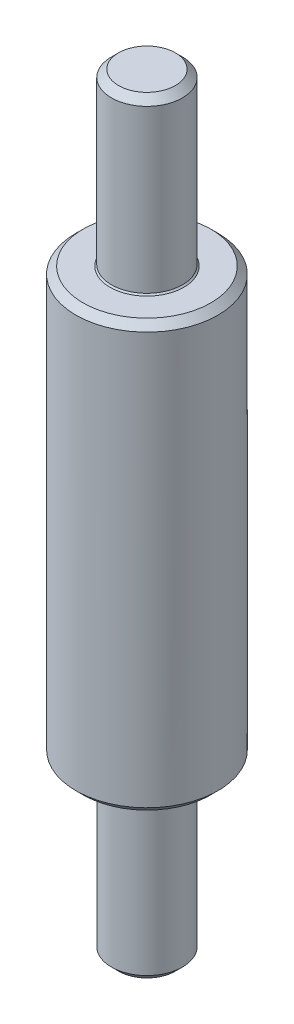
ISO-10303-21;
HEADER;
FILE_DESCRIPTION(('STEP AP214'),'2;1');
FILE_NAME('part.step','',(''),(''),'','','');
FILE_SCHEMA(('AUTOMOTIVE_DESIGN { 1 0 10303 214 1 1 1 1 }'));
ENDSEC;
DATA;
#1=APPLICATION_CONTEXT('core data for automotive mechanical design processes');
#2=APPLICATION_PROTOCOL_DEFINITION('international standard','automotive_design',2000,#1);
#3=PRODUCT_CONTEXT('',#1,'mechanical');
#4=PRODUCT('Part','Part','',(#3));
#5=PRODUCT_RELATED_PRODUCT_CATEGORY('part','',(#4));
#6=PRODUCT_DEFINITION_FORMATION('','',#4);
#7=PRODUCT_DEFINITION_CONTEXT('part definition',#1,'design');
#8=PRODUCT_DEFINITION('design','',#6,#7);
#9=PRODUCT_DEFINITION_SHAPE('','',#8);
#10=(LENGTH_UNIT() NAMED_UNIT(*) SI_UNIT(.MILLI.,.METRE.));
#11=(NAMED_UNIT(*) PLANE_ANGLE_UNIT() SI_UNIT($,.RADIAN.));
#12=(NAMED_UNIT(*) SI_UNIT($,.STERADIAN.) SOLID_ANGLE_UNIT());
#13=UNCERTAINTY_MEASURE_WITH_UNIT(LENGTH_MEASURE(1.E-05),#10,'distance_accuracy_value','');
#14=(GEOMETRIC_REPRESENTATION_CONTEXT(3) GLOBAL_UNCERTAINTY_ASSIGNED_CONTEXT((#13)) GLOBAL_UNIT_ASSIGNED_CONTEXT((#10,
#11,#12)) REPRESENTATION_CONTEXT('',''));
#15=CARTESIAN_POINT('',(0.,0.,0.));
#16=DIRECTION('',(0.,0.,1.));
#17=DIRECTION('',(1.,0.,0.));
#18=AXIS2_PLACEMENT_3D('',#15,#16,#17);
#19=CARTESIAN_POINT('',(0.,54.,0.));
#20=DIRECTION('',(0.,-1.,0.));
#21=DIRECTION('',(1.,0.,0.));
#22=AXIS2_PLACEMENT_3D('',#19,#20,#21);
#23=PLANE('',#22);
#24=CARTESIAN_POINT('',(0.,54.,0.));
#25=DIRECTION('',(0.,-1.,0.));
#26=DIRECTION('',(1.,0.,0.));
#27=AXIS2_PLACEMENT_3D('',#24,#25,#26);
#28=CIRCLE('',#27,4.00000000000002);
#29=CARTESIAN_POINT('',(4.,54.,0.));
#30=VERTEX_POINT('',#29);
#31=EDGE_CURVE('E59',#30,#30,#28,.F.);
#32=ORIENTED_EDGE('',*,*,#31,.T.);
#33=EDGE_LOOP('',(#32));
#34=FACE_BOUND('',#33,.T.);
#35=ADVANCED_FACE('F35',(#34),#23,.F.);
#36=CARTESIAN_POINT('',(0.,54.,0.));
#37=DIRECTION('',(0.,1.,0.));
#38=DIRECTION('',(-1.,0.,0.));
#39=AXIS2_PLACEMENT_3D('',#36,#37,#38);
#40=CYLINDRICAL_SURFACE('',#39,5.00000000000001);
#41=CARTESIAN_POINT('',(0.,30.2,0.));
#42=DIRECTION('',(0.,-1.,0.));
#43=DIRECTION('',(1.,0.,0.));
#44=AXIS2_PLACEMENT_3D('',#41,#42,#43);
#45=CIRCLE('',#44,5.00000000000001);
#46=CARTESIAN_POINT('',(5.,30.2,0.));
#47=VERTEX_POINT('',#46);
#48=EDGE_CURVE('E51',#47,#47,#45,.F.);
#49=ORIENTED_EDGE('',*,*,#48,.T.);
#50=EDGE_LOOP('',(#49));
#51=FACE_BOUND('',#50,.T.);
#52=CARTESIAN_POINT('',(0.,53.,0.));
#53=DIRECTION('',(0.,-1.,0.));
#54=DIRECTION('',(1.,0.,0.));
#55=AXIS2_PLACEMENT_3D('',#52,#53,#54);
#56=CIRCLE('',#55,5.00000000000001);
#57=CARTESIAN_POINT('',(4.99999999999999,53.,0.));
#58=VERTEX_POINT('',#57);
#59=EDGE_CURVE('E56',#58,#58,#56,.T.);
#60=ORIENTED_EDGE('',*,*,#59,.T.);
#61=EDGE_LOOP('',(#60));
#62=FACE_BOUND('',#61,.T.);
#63=ADVANCED_FACE('F93',(#51,#62),#40,.T.);
#64=CARTESIAN_POINT('',(5.00000000000001,30.,0.));
#65=DIRECTION('',(0.,-1.,0.));
#66=DIRECTION('',(1.,0.,0.));
#67=AXIS2_PLACEMENT_3D('',#64,#65,#66);
#68=PLANE('',#67);
#69=CARTESIAN_POINT('',(0.,30.,0.));
#70=DIRECTION('',(0.,-1.,0.));
#71=DIRECTION('',(1.,0.,0.));
#72=AXIS2_PLACEMENT_3D('',#69,#70,#71);
#73=CIRCLE('',#72,5.20000000000001);
#74=CARTESIAN_POINT('',(5.2,30.,0.));
#75=VERTEX_POINT('',#74);
#76=EDGE_CURVE('E47',#75,#75,#73,.T.);
#77=ORIENTED_EDGE('',*,*,#76,.T.);
#78=EDGE_LOOP('',(#77));
#79=FACE_BOUND('',#78,.T.);
#80=CARTESIAN_POINT('',(0.,30.,0.));
#81=DIRECTION('',(0.,-1.,0.));
#82=DIRECTION('',(1.,0.,0.));
#83=AXIS2_PLACEMENT_3D('',#80,#81,#82);
#84=CIRCLE('',#83,9.);
#85=CARTESIAN_POINT('',(8.99999999999999,30.,0.));
#86=VERTEX_POINT('',#85);
#87=EDGE_CURVE('E68',#86,#86,#84,.F.);
#88=ORIENTED_EDGE('',*,*,#87,.T.);
#89=EDGE_LOOP('',(#88));
#90=FACE_BOUND('',#89,.T.);
#91=ADVANCED_FACE('F91',(#79,#90),#68,.F.);
#92=CARTESIAN_POINT('',(0.,54.,0.));
#93=DIRECTION('',(0.,1.,0.));
#94=DIRECTION('',(-1.,0.,0.));
#95=AXIS2_PLACEMENT_3D('',#92,#93,#94);
#96=CYLINDRICAL_SURFACE('',#95,10.);
#97=CARTESIAN_POINT('',(0.,-29.,0.));
#98=DIRECTION('',(0.,1.,0.));
#99=DIRECTION('',(-1.,0.,0.));
#100=AXIS2_PLACEMENT_3D('',#97,#98,#99);
#101=CIRCLE('',#100,10.);
#102=CARTESIAN_POINT('',(-10.,-29.,0.));
#103=VERTEX_POINT('',#102);
#104=EDGE_CURVE('E74',#103,#103,#101,.T.);
#105=ORIENTED_EDGE('',*,*,#104,.T.);
#106=EDGE_LOOP('',(#105));
#107=FACE_BOUND('',#106,.T.);
#108=CARTESIAN_POINT('',(0.,29.,0.));
#109=DIRECTION('',(0.,-1.,0.));
#110=DIRECTION('',(1.,0.,0.));
#111=AXIS2_PLACEMENT_3D('',#108,#109,#110);
#112=CIRCLE('',#111,10.);
#113=CARTESIAN_POINT('',(10.,29.,0.));
#114=VERTEX_POINT('',#113);
#115=EDGE_CURVE('E77',#114,#114,#112,.T.);
#116=ORIENTED_EDGE('',*,*,#115,.T.);
#117=EDGE_LOOP('',(#116));
#118=FACE_BOUND('',#117,.T.);
#119=ADVANCED_FACE('F81',(#107,#118),#96,.T.);
#120=CARTESIAN_POINT('',(10.,-30.,0.));
#121=DIRECTION('',(0.,1.,0.));
#122=DIRECTION('',(-1.,0.,0.));
#123=AXIS2_PLACEMENT_3D('',#120,#121,#122);
#124=PLANE('',#123);
#125=CARTESIAN_POINT('',(0.,-30.,0.));
#126=DIRECTION('',(0.,1.,0.));
#127=DIRECTION('',(-1.,0.,0.));
#128=AXIS2_PLACEMENT_3D('',#125,#126,#127);
#129=CIRCLE('',#128,5.19999999999997);
#130=CARTESIAN_POINT('',(-5.19999999999997,-30.,0.));
#131=VERTEX_POINT('',#130);
#132=EDGE_CURVE('E43',#131,#131,#129,.T.);
#133=ORIENTED_EDGE('',*,*,#132,.T.);
#134=EDGE_LOOP('',(#133));
#135=FACE_BOUND('',#134,.T.);
#136=CARTESIAN_POINT('',(0.,-30.,0.));
#137=DIRECTION('',(0.,1.,0.));
#138=DIRECTION('',(-1.,0.,0.));
#139=AXIS2_PLACEMENT_3D('',#136,#137,#138);
#140=CIRCLE('',#139,8.99999999999997);
#141=CARTESIAN_POINT('',(-8.99999999999996,-30.,0.));
#142=VERTEX_POINT('',#141);
#143=EDGE_CURVE('E71',#142,#142,#140,.F.);
#144=ORIENTED_EDGE('',*,*,#143,.T.);
#145=EDGE_LOOP('',(#144));
#146=FACE_BOUND('',#145,.T.);
#147=ADVANCED_FACE('F100',(#135,#146),#124,.F.);
#148=CARTESIAN_POINT('',(0.,54.,0.));
#149=DIRECTION('',(0.,1.,0.));
#150=DIRECTION('',(-1.,0.,0.));
#151=AXIS2_PLACEMENT_3D('',#148,#149,#150);
#152=CYLINDRICAL_SURFACE('',#151,5.00000000000001);
#153=CARTESIAN_POINT('',(0.,-30.2,0.));
#154=DIRECTION('',(0.,1.,0.));
#155=DIRECTION('',(-1.,0.,0.));
#156=AXIS2_PLACEMENT_3D('',#153,#154,#155);
#157=CIRCLE('',#156,5.00000000000001);
#158=CARTESIAN_POINT('',(-5.,-30.2,0.));
#159=VERTEX_POINT('',#158);
#160=EDGE_CURVE('E10',#159,#159,#157,.F.);
#161=ORIENTED_EDGE('',*,*,#160,.T.);
#162=EDGE_LOOP('',(#161));
#163=FACE_BOUND('',#162,.T.);
#164=CARTESIAN_POINT('',(0.,-53.,0.));
#165=DIRECTION('',(0.,1.,0.));
#166=DIRECTION('',(-1.,0.,0.));
#167=AXIS2_PLACEMENT_3D('',#164,#165,#166);
#168=CIRCLE('',#167,5.00000000000001);
#169=CARTESIAN_POINT('',(-5.,-53.,0.));
#170=VERTEX_POINT('',#169);
#171=EDGE_CURVE('E65',#170,#170,#168,.T.);
#172=ORIENTED_EDGE('',*,*,#171,.T.);
#173=EDGE_LOOP('',(#172));
#174=FACE_BOUND('',#173,.T.);
#175=ADVANCED_FACE('F163',(#163,#174),#152,.T.);
#176=CARTESIAN_POINT('',(5.00000000000001,-54.,0.));
#177=DIRECTION('',(0.,1.,0.));
#178=DIRECTION('',(-1.,0.,0.));
#179=AXIS2_PLACEMENT_3D('',#176,#177,#178);
#180=PLANE('',#179);
#181=CARTESIAN_POINT('',(0.,-54.,0.));
#182=DIRECTION('',(0.,1.,0.));
#183=DIRECTION('',(-1.,0.,0.));
#184=AXIS2_PLACEMENT_3D('',#181,#182,#183);
#185=CIRCLE('',#184,3.99999999999999);
#186=CARTESIAN_POINT('',(-3.99999999999998,-54.,0.));
#187=VERTEX_POINT('',#186);
#188=EDGE_CURVE('E62',#187,#187,#185,.F.);
#189=ORIENTED_EDGE('',*,*,#188,.T.);
#190=EDGE_LOOP('',(#189));
#191=FACE_BOUND('',#190,.T.);
#192=ADVANCED_FACE('F116',(#191),#180,.F.);
#193=CARTESIAN_POINT('',(0.,-29.,0.));
#194=DIRECTION('',(0.,1.,0.));
#195=DIRECTION('',(-1.,0.,0.));
#196=AXIS2_PLACEMENT_3D('',#193,#194,#195);
#197=CONICAL_SURFACE('',#196,10.,0.785398163397456);
#198=ORIENTED_EDGE('',*,*,#143,.F.);
#199=EDGE_LOOP('',(#198));
#200=FACE_BOUND('',#199,.T.);
#201=ORIENTED_EDGE('',*,*,#104,.F.);
#202=EDGE_LOOP('',(#201));
#203=FACE_BOUND('',#202,.T.);
#204=ADVANCED_FACE('F87',(#200,#203),#197,.T.);
#205=CARTESIAN_POINT('',(0.,30.,0.));
#206=DIRECTION('',(0.,-1.,0.));
#207=DIRECTION('',(1.,0.,0.));
#208=AXIS2_PLACEMENT_3D('',#205,#206,#207);
#209=CONICAL_SURFACE('',#208,9.,0.785398163397446);
#210=ORIENTED_EDGE('',*,*,#115,.F.);
#211=EDGE_LOOP('',(#210));
#212=FACE_BOUND('',#211,.T.);
#213=ORIENTED_EDGE('',*,*,#87,.F.);
#214=EDGE_LOOP('',(#213));
#215=FACE_BOUND('',#214,.T.);
#216=ADVANCED_FACE('F83',(#212,#215),#209,.T.);
#217=CARTESIAN_POINT('',(0.,-53.,0.));
#218=DIRECTION('',(0.,1.,0.));
#219=DIRECTION('',(-1.,0.,0.));
#220=AXIS2_PLACEMENT_3D('',#217,#218,#219);
#221=CONICAL_SURFACE('',#220,5.00000000000001,0.78539816339745);
#222=ORIENTED_EDGE('',*,*,#188,.F.);
#223=EDGE_LOOP('',(#222));
#224=FACE_BOUND('',#223,.T.);
#225=ORIENTED_EDGE('',*,*,#171,.F.);
#226=EDGE_LOOP('',(#225));
#227=FACE_BOUND('',#226,.T.);
#228=ADVANCED_FACE('F86',(#224,#227),#221,.T.);
#229=CARTESIAN_POINT('',(0.,54.,0.));
#230=DIRECTION('',(0.,-1.,0.));
#231=DIRECTION('',(1.,0.,0.));
#232=AXIS2_PLACEMENT_3D('',#229,#230,#231);
#233=CONICAL_SURFACE('',#232,4.00000000000002,0.785398163397448);
#234=ORIENTED_EDGE('',*,*,#59,.F.);
#235=EDGE_LOOP('',(#234));
#236=FACE_BOUND('',#235,.T.);
#237=ORIENTED_EDGE('',*,*,#31,.F.);
#238=EDGE_LOOP('',(#237));
#239=FACE_BOUND('',#238,.T.);
#240=ADVANCED_FACE('F127',(#236,#239),#233,.T.);
#241=CARTESIAN_POINT('',(0.,30.2,0.));
#242=DIRECTION('',(0.,-1.,0.));
#243=DIRECTION('',(1.,0.,0.));
#244=AXIS2_PLACEMENT_3D('',#241,#242,#243);
#245=CONICAL_SURFACE('',#244,5.00000000000001,0.785398163397422);
#246=ORIENTED_EDGE('',*,*,#76,.F.);
#247=EDGE_LOOP('',(#246));
#248=FACE_BOUND('',#247,.T.);
#249=ORIENTED_EDGE('',*,*,#48,.F.);
#250=EDGE_LOOP('',(#249));
#251=FACE_BOUND('',#250,.T.);
#252=ADVANCED_FACE('F133',(#248,#251),#245,.T.);
#253=CARTESIAN_POINT('',(0.,-30.,0.));
#254=DIRECTION('',(0.,1.,0.));
#255=DIRECTION('',(-1.,0.,0.));
#256=AXIS2_PLACEMENT_3D('',#253,#254,#255);
#257=CONICAL_SURFACE('',#256,5.19999999999998,0.785398163397442);
#258=CARTESIAN_POINT('',(-5.,-30.2,0.));
#259=CARTESIAN_POINT('',(-5.00208333333333,-30.1979166666666,0.));
#260=CARTESIAN_POINT('',(-5.00416666666667,-30.1958333333333,0.));
#261=CARTESIAN_POINT('',(-5.00833333333333,-30.1916666666666,0.));
#262=CARTESIAN_POINT('',(-5.01041666666667,-30.1895833333333,0.));
#263=CARTESIAN_POINT('',(-5.01458333333333,-30.1854166666666,0.));
#264=CARTESIAN_POINT('',(-5.01666666666666,-30.1833333333333,0.));
#265=CARTESIAN_POINT('',(-5.02083333333333,-30.1791666666666,0.));
#266=CARTESIAN_POINT('',(-5.02291666666666,-30.1770833333333,0.));
#267=CARTESIAN_POINT('',(-5.02708333333333,-30.1729166666666,0.));
#268=CARTESIAN_POINT('',(-5.02916666666666,-30.1708333333333,0.));
#269=CARTESIAN_POINT('',(-5.03333333333333,-30.1666666666666,0.));
#270=CARTESIAN_POINT('',(-5.03541666666666,-30.1645833333333,0.));
#271=CARTESIAN_POINT('',(-5.03958333333333,-30.1604166666666,0.));
#272=CARTESIAN_POINT('',(-5.04166666666666,-30.1583333333333,0.));
#273=CARTESIAN_POINT('',(-5.04583333333333,-30.1541666666666,0.));
#274=CARTESIAN_POINT('',(-5.04791666666666,-30.1520833333333,0.));
#275=CARTESIAN_POINT('',(-5.05208333333333,-30.1479166666666,0.));
#276=CARTESIAN_POINT('',(-5.05416666666666,-30.1458333333333,0.));
#277=CARTESIAN_POINT('',(-5.05833333333332,-30.1416666666666,0.));
#278=CARTESIAN_POINT('',(-5.06041666666666,-30.1395833333333,0.));
#279=CARTESIAN_POINT('',(-5.06458333333332,-30.1354166666666,0.));
#280=CARTESIAN_POINT('',(-5.06666666666666,-30.1333333333333,0.));
#281=CARTESIAN_POINT('',(-5.07083333333332,-30.1291666666667,0.));
#282=CARTESIAN_POINT('',(-5.07291666666665,-30.1270833333333,0.));
#283=CARTESIAN_POINT('',(-5.07708333333332,-30.1229166666667,0.));
#284=CARTESIAN_POINT('',(-5.07916666666665,-30.1208333333333,0.));
#285=CARTESIAN_POINT('',(-5.08333333333332,-30.1166666666667,0.));
#286=CARTESIAN_POINT('',(-5.08541666666665,-30.1145833333333,0.));
#287=CARTESIAN_POINT('',(-5.08958333333332,-30.1104166666667,0.));
#288=CARTESIAN_POINT('',(-5.09166666666665,-30.1083333333333,0.));
#289=CARTESIAN_POINT('',(-5.09583333333332,-30.1041666666667,0.));
#290=CARTESIAN_POINT('',(-5.09791666666665,-30.1020833333333,0.));
#291=CARTESIAN_POINT('',(-5.10208333333332,-30.0979166666667,0.));
#292=CARTESIAN_POINT('',(-5.10416666666665,-30.0958333333333,0.));
#293=CARTESIAN_POINT('',(-5.10833333333332,-30.0916666666667,0.));
#294=CARTESIAN_POINT('',(-5.11041666666665,-30.0895833333333,0.));
#295=CARTESIAN_POINT('',(-5.11458333333331,-30.0854166666667,0.));
#296=CARTESIAN_POINT('',(-5.11666666666665,-30.0833333333333,0.));
#297=CARTESIAN_POINT('',(-5.12083333333331,-30.0791666666667,0.));
#298=CARTESIAN_POINT('',(-5.12291666666665,-30.0770833333333,0.));
#299=CARTESIAN_POINT('',(-5.12708333333331,-30.0729166666667,0.));
#300=CARTESIAN_POINT('',(-5.12916666666665,-30.0708333333333,0.));
#301=CARTESIAN_POINT('',(-5.13333333333331,-30.0666666666667,0.));
#302=CARTESIAN_POINT('',(-5.13541666666664,-30.0645833333333,0.));
#303=CARTESIAN_POINT('',(-5.13958333333331,-30.0604166666667,0.));
#304=CARTESIAN_POINT('',(-5.14166666666664,-30.0583333333333,0.));
#305=CARTESIAN_POINT('',(-5.14583333333331,-30.0541666666667,0.));
#306=CARTESIAN_POINT('',(-5.14791666666664,-30.0520833333333,0.));
#307=CARTESIAN_POINT('',(-5.15208333333331,-30.0479166666667,0.));
#308=CARTESIAN_POINT('',(-5.15416666666664,-30.0458333333333,0.));
#309=CARTESIAN_POINT('',(-5.15833333333331,-30.0416666666667,0.));
#310=CARTESIAN_POINT('',(-5.16041666666664,-30.0395833333333,0.));
#311=CARTESIAN_POINT('',(-5.16458333333331,-30.0354166666667,0.));
#312=CARTESIAN_POINT('',(-5.16666666666664,-30.0333333333333,0.));
#313=CARTESIAN_POINT('',(-5.1708333333333,-30.0291666666667,0.));
#314=CARTESIAN_POINT('',(-5.17291666666664,-30.0270833333333,0.));
#315=CARTESIAN_POINT('',(-5.1770833333333,-30.0229166666667,0.));
#316=CARTESIAN_POINT('',(-5.17916666666664,-30.0208333333333,0.));
#317=CARTESIAN_POINT('',(-5.1833333333333,-30.0166666666667,0.));
#318=CARTESIAN_POINT('',(-5.18541666666663,-30.0145833333333,0.));
#319=CARTESIAN_POINT('',(-5.1895833333333,-30.0104166666667,0.));
#320=CARTESIAN_POINT('',(-5.19166666666663,-30.0083333333333,0.));
#321=CARTESIAN_POINT('',(-5.1958333333333,-30.0041666666667,0.));
#322=CARTESIAN_POINT('',(-5.19791666666663,-30.0020833333333,0.));
#323=CARTESIAN_POINT('',(-5.19999999999997,-30.,0.));
#324=B_SPLINE_CURVE_WITH_KNOTS('',3,(#258,#259,#260,#261,#262,#263,#264,#265,#266,#267,#268,
#269,#270,#271,#272,#273,#274,#275,#276,#277,#278,#279,#280,#281,#282,#283,#284,#285,#286,#287,
#288,#289,#290,#291,#292,#293,#294,#295,#296,#297,#298,#299,#300,#301,#302,#303,#304,#305,#306,
#307,#308,#309,#310,#311,#312,#313,#314,#315,#316,#317,#318,#319,#320,#321,#322,#323),
.UNSPECIFIED.,.F.,.F.,(4,2,2,2,2,2,2,2,2,2,2,2,2,2,2,2,2,2,2,2,2,2,2,2,2,2,2,2,2,2,2,2,4),(0.,
0.00883883476483026,0.0176776695296611,0.026516504294492,0.0353553390593223,0.0441941738241531,
0.0530330085889834,0.0618718433538143,0.0707106781186445,0.0795495128834754,0.0883883476483056,
0.0972271824131341,0.106066017177964,0.114904851942795,0.123743686707625,0.132582521472456,
0.141421356237287,0.150260191002117,0.159099025766948,0.167937860531779,0.176776695296609,
0.18561553006144,0.194454364826268,0.203293199591098,0.212132034355929,0.22097086912076,
0.22980970388559,0.238648538650421,0.247487373415252,0.256326208180082,0.265165042944913,
0.274003877709743,0.282842712474574),.UNSPECIFIED.);
#325=EDGE_CURVE('BSEAM38',#159,#131,#324,.T.);
#326=ORIENTED_EDGE('',*,*,#160,.F.);
#327=ORIENTED_EDGE('',*,*,#132,.F.);
#328=ORIENTED_EDGE('',*,*,#325,.T.);
#329=ORIENTED_EDGE('',*,*,#325,.F.);
#330=EDGE_LOOP('',(#326,#328,#327,#329));
#331=FACE_BOUND('',#330,.T.);
#332=ADVANCED_FACE('F38',(#331),#257,.T.);
#333=CLOSED_SHELL('',(#35,#63,#91,#119,#147,#175,#192,#204,#216,#228,#240,#252,#332));
#334=MANIFOLD_SOLID_BREP('B2',#333);
#335=ADVANCED_BREP_SHAPE_REPRESENTATION('',(#18,#334),#14);
#336=SHAPE_DEFINITION_REPRESENTATION(#9,#335);
ENDSEC;
END-ISO-10303-21;
